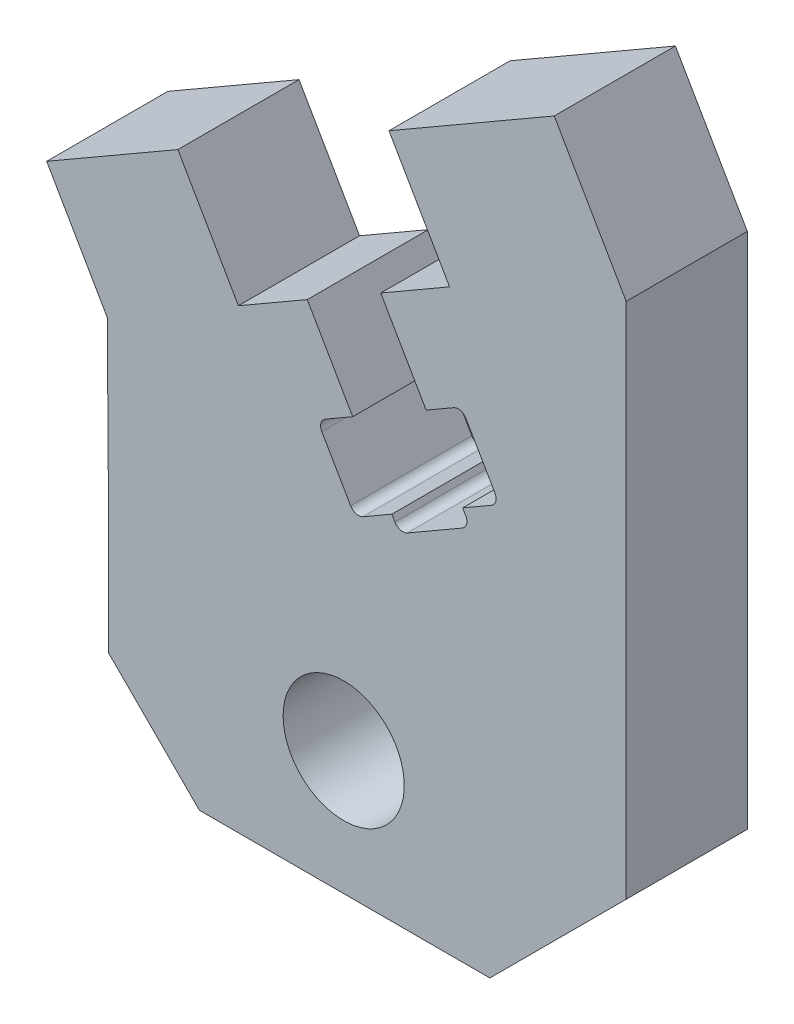
ISO-10303-21;
HEADER;
FILE_DESCRIPTION(('STEP AP214'),'2;1');
FILE_NAME('part.step','',(''),(''),'','','');
FILE_SCHEMA(('AUTOMOTIVE_DESIGN { 1 0 10303 214 1 1 1 1 }'));
ENDSEC;
DATA;
#1=APPLICATION_CONTEXT('core data for automotive mechanical design processes');
#2=APPLICATION_PROTOCOL_DEFINITION('international standard','automotive_design',2000,#1);
#3=PRODUCT_CONTEXT('',#1,'mechanical');
#4=PRODUCT('Part','Part','',(#3));
#5=PRODUCT_RELATED_PRODUCT_CATEGORY('part','',(#4));
#6=PRODUCT_DEFINITION_FORMATION('','',#4);
#7=PRODUCT_DEFINITION_CONTEXT('part definition',#1,'design');
#8=PRODUCT_DEFINITION('design','',#6,#7);
#9=PRODUCT_DEFINITION_SHAPE('','',#8);
#10=(LENGTH_UNIT() NAMED_UNIT(*) SI_UNIT(.MILLI.,.METRE.));
#11=(NAMED_UNIT(*) PLANE_ANGLE_UNIT() SI_UNIT($,.RADIAN.));
#12=(NAMED_UNIT(*) SI_UNIT($,.STERADIAN.) SOLID_ANGLE_UNIT());
#13=UNCERTAINTY_MEASURE_WITH_UNIT(LENGTH_MEASURE(1.E-05),#10,'distance_accuracy_value','');
#14=(GEOMETRIC_REPRESENTATION_CONTEXT(3) GLOBAL_UNCERTAINTY_ASSIGNED_CONTEXT((#13)) GLOBAL_UNIT_ASSIGNED_CONTEXT((#10,
#11,#12)) REPRESENTATION_CONTEXT('',''));
#15=CARTESIAN_POINT('',(0.,0.,0.));
#16=DIRECTION('',(0.,0.,1.));
#17=DIRECTION('',(1.,0.,0.));
#18=AXIS2_PLACEMENT_3D('',#15,#16,#17);
#19=CARTESIAN_POINT('',(-127.251564890503,105.942182286836,4.));
#20=DIRECTION('',(0.499999999999998,-0.86602540378444,0.));
#21=DIRECTION('',(0.86602540378444,0.499999999999998,0.));
#22=AXIS2_PLACEMENT_3D('',#19,#20,#21);
#23=PLANE('',#22);
#24=DIRECTION('',(-0.86602540378444,-0.499999999999998,0.));
#25=VECTOR('',#24,1.);
#26=CARTESIAN_POINT('',(-127.251564890503,105.942182286836,0.));
#27=LINE('',#26,#25);
#28=CARTESIAN_POINT('',(-115.950869184989,112.466641994445,0.));
#29=VERTEX_POINT('',#28);
#30=CARTESIAN_POINT('',(-118.219555533488,111.156815320432,0.));
#31=VERTEX_POINT('',#30);
#32=EDGE_CURVE('E565',#29,#31,#27,.T.);
#33=ORIENTED_EDGE('',*,*,#32,.T.);
#34=DIRECTION('',(0.,0.,1.));
#35=VECTOR('',#34,1.);
#36=CARTESIAN_POINT('',(-118.219555533488,111.156815320432,4.));
#37=LINE('',#36,#35);
#38=CARTESIAN_POINT('',(-118.219555533488,111.156815320432,4.));
#39=VERTEX_POINT('',#38);
#40=EDGE_CURVE('E11',#31,#39,#37,.T.);
#41=ORIENTED_EDGE('',*,*,#40,.T.);
#42=DIRECTION('',(-0.86602540378444,-0.499999999999998,0.));
#43=VECTOR('',#42,1.);
#44=CARTESIAN_POINT('',(-127.251564890503,105.942182286836,4.));
#45=LINE('',#44,#43);
#46=CARTESIAN_POINT('',(-115.950869184989,112.466641994445,4.));
#47=VERTEX_POINT('',#46);
#48=EDGE_CURVE('E555',#47,#39,#45,.T.);
#49=ORIENTED_EDGE('',*,*,#48,.F.);
#50=DIRECTION('',(0.,0.,1.));
#51=VECTOR('',#50,1.);
#52=CARTESIAN_POINT('',(-115.950869184989,112.466641994445,-2.26694974146776E-13));
#53=LINE('',#52,#51);
#54=EDGE_CURVE('E513',#29,#47,#53,.T.);
#55=ORIENTED_EDGE('',*,*,#54,.F.);
#56=EDGE_LOOP('',(#33,#41,#49,#55));
#57=FACE_BOUND('',#56,.T.);
#58=ADVANCED_FACE('F44',(#57),#23,.F.);
#59=CARTESIAN_POINT('',(0.,0.,4.));
#60=DIRECTION('',(0.,0.,-1.));
#61=DIRECTION('',(-1.,0.,0.));
#62=AXIS2_PLACEMENT_3D('',#59,#60,#61);
#63=PLANE('',#62);
#64=ORIENTED_EDGE('',*,*,#48,.T.);
#65=DIRECTION('',(0.491652426110984,-0.870791531825605,0.));
#66=VECTOR('',#65,1.);
#67=CARTESIAN_POINT('',(-42.0540671269402,-23.7438966447542,4.));
#68=LINE('',#67,#66);
#69=CARTESIAN_POINT('',(-117.973717962987,110.721399438748,4.));
#70=VERTEX_POINT('',#69);
#71=EDGE_CURVE('E398',#39,#70,#68,.T.);
#72=ORIENTED_EDGE('',*,*,#71,.T.);
#73=DIRECTION('',(0.499999999999994,-0.866025403784442,0.));
#74=VECTOR('',#73,1.);
#75=CARTESIAN_POINT('',(-40.5365161439809,-23.4037685077366,4.));
#76=LINE('',#75,#74);
#77=CARTESIAN_POINT('',(-116.723717962987,108.556335929287,4.));
#78=VERTEX_POINT('',#77);
#79=EDGE_CURVE('E456',#70,#78,#76,.T.);
#80=ORIENTED_EDGE('',*,*,#79,.T.);
#81=DIRECTION('',(0.866025403784442,0.499999999999994,0.));
#82=VECTOR('',#81,1.);
#83=CARTESIAN_POINT('',(-76.1872018190058,131.960104437024,4.));
#84=LINE('',#83,#82);
#85=CARTESIAN_POINT('',(-115.814391289013,109.081335929287,4.));
#86=VERTEX_POINT('',#85);
#87=EDGE_CURVE('E460',#78,#86,#84,.T.);
#88=ORIENTED_EDGE('',*,*,#87,.T.);
#89=CARTESIAN_POINT('',(-115.664391289013,108.821528308152,4.));
#90=DIRECTION('',(0.,0.,-1.));
#91=DIRECTION('',(-1.,0.,0.));
#92=AXIS2_PLACEMENT_3D('',#89,#90,#91);
#93=CIRCLE('',#92,0.300000000000005);
#94=CARTESIAN_POINT('',(-115.404583667878,108.971528308152,4.));
#95=VERTEX_POINT('',#94);
#96=EDGE_CURVE('E262',#86,#95,#93,.T.);
#97=ORIENTED_EDGE('',*,*,#96,.T.);
#98=DIRECTION('',(0.499999999999995,-0.866025403784441,0.));
#99=VECTOR('',#98,1.);
#100=CARTESIAN_POINT('',(-39.3673818488717,-22.7287685077366,4.));
#101=LINE('',#100,#99);
#102=CARTESIAN_POINT('',(-114.454583667878,107.326080040962,4.));
#103=VERTEX_POINT('',#102);
#104=EDGE_CURVE('E404',#95,#103,#101,.T.);
#105=ORIENTED_EDGE('',*,*,#104,.T.);
#106=CARTESIAN_POINT('',(-114.714391289013,107.176080040962,4.));
#107=DIRECTION('',(0.,0.,-1.));
#108=DIRECTION('',(-1.,0.,0.));
#109=AXIS2_PLACEMENT_3D('',#106,#107,#108);
#110=CIRCLE('',#109,0.299999999999996);
#111=CARTESIAN_POINT('',(-114.564391289013,106.916272419826,4.));
#112=VERTEX_POINT('',#111);
#113=EDGE_CURVE('E408',#103,#112,#110,.T.);
#114=ORIENTED_EDGE('',*,*,#113,.T.);
#115=DIRECTION('',(-0.866025403784439,-0.5,0.));
#116=VECTOR('',#115,1.);
#117=CARTESIAN_POINT('',(-74.9372018190068,129.795040927563,4.));
#118=LINE('',#117,#116);
#119=CARTESIAN_POINT('',(-115.517019233176,106.366272419826,4.));
#120=VERTEX_POINT('',#119);
#121=EDGE_CURVE('E412',#112,#120,#118,.T.);
#122=ORIENTED_EDGE('',*,*,#121,.T.);
#123=DIRECTION('',(0.500000000000073,-0.866025403784397,0.));
#124=VECTOR('',#123,1.);
#125=CARTESIAN_POINT('',(-40.5798174141562,-23.4287685077335,4.));
#126=LINE('',#125,#124);
#127=CARTESIAN_POINT('',(-115.417019233176,106.193067339069,4.));
#128=VERTEX_POINT('',#127);
#129=EDGE_CURVE('E416',#120,#128,#126,.T.);
#130=ORIENTED_EDGE('',*,*,#129,.T.);
#131=CARTESIAN_POINT('',(-115.676826854311,106.043067339069,4.));
#132=DIRECTION('',(0.,0.,-1.));
#133=DIRECTION('',(-1.,0.,0.));
#134=AXIS2_PLACEMENT_3D('',#131,#132,#133);
#135=CIRCLE('',#134,0.300000000000002);
#136=CARTESIAN_POINT('',(-115.526826854311,105.783259717934,4.));
#137=VERTEX_POINT('',#136);
#138=EDGE_CURVE('E420',#128,#137,#135,.T.);
#139=ORIENTED_EDGE('',*,*,#138,.T.);
#140=DIRECTION('',(-0.86602540378444,-0.499999999999997,0.));
#141=VECTOR('',#140,1.);
#142=CARTESIAN_POINT('',(-74.6872018190063,129.362028225671,4.));
#143=LINE('',#142,#141);
#144=CARTESIAN_POINT('',(-117.345480202259,104.733259717934,4.));
#145=VERTEX_POINT('',#144);
#146=EDGE_CURVE('E424',#137,#145,#143,.T.);
#147=ORIENTED_EDGE('',*,*,#146,.T.);
#148=CARTESIAN_POINT('',(-117.495480202259,104.993067339069,4.));
#149=DIRECTION('',(0.,0.,-1.));
#150=DIRECTION('',(-1.,0.,0.));
#151=AXIS2_PLACEMENT_3D('',#148,#149,#150);
#152=CIRCLE('',#151,0.299999999999999);
#153=CARTESIAN_POINT('',(-117.755287823394,104.843067339069,4.));
#154=VERTEX_POINT('',#153);
#155=EDGE_CURVE('E428',#145,#154,#152,.T.);
#156=ORIENTED_EDGE('',*,*,#155,.T.);
#157=DIRECTION('',(-0.499999999999939,0.866025403784474,0.));
#158=VECTOR('',#157,1.);
#159=CARTESIAN_POINT('',(-42.9180860043979,-24.7787685077386,4.));
#160=LINE('',#159,#158);
#161=CARTESIAN_POINT('',(-117.855287823394,105.016272419826,4.));
#162=VERTEX_POINT('',#161);
#163=EDGE_CURVE('E432',#154,#162,#160,.T.);
#164=ORIENTED_EDGE('',*,*,#163,.T.);
#165=DIRECTION('',(-0.866025403784436,-0.500000000000005,0.));
#166=VECTOR('',#165,1.);
#167=CARTESIAN_POINT('',(-74.9372018190078,129.795040927562,4.));
#168=LINE('',#167,#166);
#169=CARTESIAN_POINT('',(-118.807915767557,104.466272419826,4.));
#170=VERTEX_POINT('',#169);
#171=EDGE_CURVE('E436',#162,#170,#168,.T.);
#172=ORIENTED_EDGE('',*,*,#171,.T.);
#173=CARTESIAN_POINT('',(-118.957915767557,104.726080040962,4.));
#174=DIRECTION('',(0.,0.,-1.));
#175=DIRECTION('',(-1.,0.,0.));
#176=AXIS2_PLACEMENT_3D('',#173,#174,#175);
#177=CIRCLE('',#176,0.300000000000005);
#178=CARTESIAN_POINT('',(-119.217723388692,104.576080040962,4.));
#179=VERTEX_POINT('',#178);
#180=EDGE_CURVE('E440',#170,#179,#177,.T.);
#181=ORIENTED_EDGE('',*,*,#180,.T.);
#182=DIRECTION('',(-0.499999999999975,0.866025403784453,0.));
#183=VECTOR('',#182,1.);
#184=CARTESIAN_POINT('',(-44.1305215696898,-25.4787685077373,4.));
#185=LINE('',#184,#183);
#186=CARTESIAN_POINT('',(-120.167723388692,106.221528308152,4.));
#187=VERTEX_POINT('',#186);
#188=EDGE_CURVE('E444',#179,#187,#185,.T.);
#189=ORIENTED_EDGE('',*,*,#188,.T.);
#190=CARTESIAN_POINT('',(-119.907915767557,106.371528308152,4.));
#191=DIRECTION('',(0.,0.,-1.));
#192=DIRECTION('',(-1.,0.,0.));
#193=AXIS2_PLACEMENT_3D('',#190,#191,#192);
#194=CIRCLE('',#193,0.300000000000027);
#195=CARTESIAN_POINT('',(-120.057915767557,106.631335929287,4.));
#196=VERTEX_POINT('',#195);
#197=EDGE_CURVE('E448',#187,#196,#194,.T.);
#198=ORIENTED_EDGE('',*,*,#197,.T.);
#199=DIRECTION('',(0.866025403784439,0.499999999999999,0.));
#200=VECTOR('',#199,1.);
#201=CARTESIAN_POINT('',(-76.1872018190066,131.960104437024,4.));
#202=LINE('',#201,#200);
#203=CARTESIAN_POINT('',(-119.148589093583,107.156335929287,4.));
#204=VERTEX_POINT('',#203);
#205=EDGE_CURVE('E452',#196,#204,#202,.T.);
#206=ORIENTED_EDGE('',*,*,#205,.T.);
#207=DIRECTION('',(-0.499999999999999,0.866025403784439,0.));
#208=VECTOR('',#207,1.);
#209=CARTESIAN_POINT('',(-42.9613872745764,-24.8037685077364,4.));
#210=LINE('',#209,#208);
#211=CARTESIAN_POINT('',(-120.648589093583,109.754412140641,4.));
#212=VERTEX_POINT('',#211);
#213=EDGE_CURVE('E350',#204,#212,#210,.T.);
#214=ORIENTED_EDGE('',*,*,#213,.T.);
#215=CARTESIAN_POINT('',(-122.921437871581,108.442182286836,4.));
#216=VERTEX_POINT('',#215);
#217=EDGE_CURVE('E560',#212,#216,#45,.T.);
#218=ORIENTED_EDGE('',*,*,#217,.T.);
#219=DIRECTION('',(0.499999999999998,-0.86602540378444,0.));
#220=VECTOR('',#219,1.);
#221=CARTESIAN_POINT('',(-125.421437871581,112.772309305759,4.));
#222=LINE('',#221,#220);
#223=CARTESIAN_POINT('',(-124.921437871581,111.906283901974,4.));
#224=VERTEX_POINT('',#223);
#225=EDGE_CURVE('E537',#224,#216,#222,.T.);
#226=ORIENTED_EDGE('',*,*,#225,.F.);
#227=DIRECTION('',(0.866025403784441,0.499999999999996,0.));
#228=VECTOR('',#227,1.);
#229=CARTESIAN_POINT('',(-129.251564890503,109.406283901974,4.));
#230=LINE('',#229,#228);
#231=CARTESIAN_POINT('',(-129.251564890503,109.406283901974,4.));
#232=VERTEX_POINT('',#231);
#233=EDGE_CURVE('E467',#232,#224,#230,.T.);
#234=ORIENTED_EDGE('',*,*,#233,.F.);
#235=DIRECTION('',(0.499999999999998,-0.86602540378444,0.));
#236=VECTOR('',#235,1.);
#237=CARTESIAN_POINT('',(-129.751564890503,110.272309305759,4.));
#238=LINE('',#237,#236);
#239=CARTESIAN_POINT('',(-127.251564890503,105.942182286836,4.));
#240=VERTEX_POINT('',#239);
#241=EDGE_CURVE('E527',#232,#240,#238,.T.);
#242=ORIENTED_EDGE('',*,*,#241,.T.);
#243=DIRECTION('',(0.00760615536184808,-0.999971072781914,0.));
#244=VECTOR('',#243,1.);
#245=CARTESIAN_POINT('',(-127.209199434183,100.372452404922,4.));
#246=LINE('',#245,#244);
#247=CARTESIAN_POINT('',(-127.209199434183,100.372452404922,4.));
#248=VERTEX_POINT('',#247);
#249=EDGE_CURVE('E559',#240,#248,#246,.T.);
#250=ORIENTED_EDGE('',*,*,#249,.T.);
#251=DIRECTION('',(0.,1.,0.));
#252=VECTOR('',#251,1.);
#253=CARTESIAN_POINT('',(-127.209199434183,98.3724524049218,4.));
#254=LINE('',#253,#252);
#255=CARTESIAN_POINT('',(-127.209199434183,96.3724524049218,4.));
#256=VERTEX_POINT('',#255);
#257=EDGE_CURVE('E549',#256,#248,#254,.T.);
#258=ORIENTED_EDGE('',*,*,#257,.F.);
#259=DIRECTION('',(0.707106781186548,-0.707106781186548,0.));
#260=VECTOR('',#259,1.);
#261=CARTESIAN_POINT('',(-124.209199434183,93.3724524049218,4.));
#262=LINE('',#261,#260);
#263=CARTESIAN_POINT('',(-124.209199434183,93.3724524049218,4.));
#264=VERTEX_POINT('',#263);
#265=EDGE_CURVE('E590',#256,#264,#262,.T.);
#266=ORIENTED_EDGE('',*,*,#265,.T.);
#267=DIRECTION('',(-1.,0.,0.));
#268=VECTOR('',#267,1.);
#269=CARTESIAN_POINT('',(-111.620742166067,93.3724524049218,4.));
#270=LINE('',#269,#268);
#271=CARTESIAN_POINT('',(-114.620742166067,93.3724524049218,4.));
#272=VERTEX_POINT('',#271);
#273=EDGE_CURVE('E541',#272,#264,#270,.T.);
#274=ORIENTED_EDGE('',*,*,#273,.F.);
#275=DIRECTION('',(0.707106781186544,0.707106781186551,0.));
#276=VECTOR('',#275,1.);
#277=CARTESIAN_POINT('',(-114.620742166067,93.3724524049218,4.));
#278=LINE('',#277,#276);
#279=CARTESIAN_POINT('',(-110.120742166067,97.8724524049218,4.));
#280=VERTEX_POINT('',#279);
#281=EDGE_CURVE('E593',#272,#280,#278,.T.);
#282=ORIENTED_EDGE('',*,*,#281,.T.);
#283=DIRECTION('',(0.,1.,0.));
#284=VECTOR('',#283,1.);
#285=CARTESIAN_POINT('',(-110.120742166067,114.966641994445,4.));
#286=LINE('',#285,#284);
#287=CARTESIAN_POINT('',(-110.120742166067,114.966641994445,4.));
#288=VERTEX_POINT('',#287);
#289=EDGE_CURVE('E491',#280,#288,#286,.T.);
#290=ORIENTED_EDGE('',*,*,#289,.T.);
#291=DIRECTION('',(-0.499999999999993,0.866025403784443,0.));
#292=VECTOR('',#291,1.);
#293=CARTESIAN_POINT('',(-110.120742166067,114.966641994445,4.));
#294=LINE('',#293,#292);
#295=CARTESIAN_POINT('',(-112.495742166067,119.080262662421,4.));
#296=VERTEX_POINT('',#295);
#297=EDGE_CURVE('E487',#288,#296,#294,.T.);
#298=ORIENTED_EDGE('',*,*,#297,.T.);
#299=DIRECTION('',(0.866025403784439,0.5,0.));
#300=VECTOR('',#299,1.);
#301=CARTESIAN_POINT('',(-117.950869184989,115.930743609583,4.));
#302=LINE('',#301,#300);
#303=CARTESIAN_POINT('',(-117.950869184989,115.930743609583,4.));
#304=VERTEX_POINT('',#303);
#305=EDGE_CURVE('E468',#304,#296,#302,.T.);
#306=ORIENTED_EDGE('',*,*,#305,.F.);
#307=DIRECTION('',(0.499999999999998,-0.86602540378444,0.));
#308=VECTOR('',#307,1.);
#309=CARTESIAN_POINT('',(-118.450869184989,116.796769013367,4.));
#310=LINE('',#309,#308);
#311=EDGE_CURVE('E517',#304,#47,#310,.T.);
#312=ORIENTED_EDGE('',*,*,#311,.T.);
#313=EDGE_LOOP('',(#64,#72,#80,#88,#97,#105,#114,#122,#130,#139,#147,#156,#164,#172,#181,#189,
#198,#206,#214,#218,#226,#234,#242,#250,#258,#266,#274,#282,#290,#298,#306,#312));
#314=FACE_BOUND('',#313,.T.);
#315=CARTESIAN_POINT('',(-119.446049425251,97.4583176850972,4.));
#316=DIRECTION('',(0.,0.,-1.));
#317=DIRECTION('',(-1.,0.,0.));
#318=AXIS2_PLACEMENT_3D('',#315,#316,#317);
#319=CIRCLE('',#318,1.99999999999999);
#320=CARTESIAN_POINT('',(-121.446049425251,97.4583176850972,4.));
#321=VERTEX_POINT('',#320);
#322=EDGE_CURVE('E509',#321,#321,#319,.T.);
#323=ORIENTED_EDGE('',*,*,#322,.T.);
#324=EDGE_LOOP('',(#323));
#325=FACE_BOUND('',#324,.T.);
#326=ADVANCED_FACE('F616',(#314,#325),#63,.F.);
#327=CARTESIAN_POINT('',(0.,0.,0.));
#328=DIRECTION('',(0.,0.,-1.));
#329=DIRECTION('',(-1.,0.,0.));
#330=AXIS2_PLACEMENT_3D('',#327,#328,#329);
#331=PLANE('',#330);
#332=DIRECTION('',(0.491652426110985,-0.870791531825605,0.));
#333=VECTOR('',#332,1.);
#334=CARTESIAN_POINT('',(-117.973717962987,110.721399438748,0.));
#335=LINE('',#334,#333);
#336=CARTESIAN_POINT('',(-117.973717962987,110.721399438748,0.));
#337=VERTEX_POINT('',#336);
#338=EDGE_CURVE('E342',#31,#337,#335,.T.);
#339=ORIENTED_EDGE('',*,*,#338,.F.);
#340=ORIENTED_EDGE('',*,*,#32,.F.);
#341=DIRECTION('',(0.499999999999998,-0.86602540378444,0.));
#342=VECTOR('',#341,1.);
#343=CARTESIAN_POINT('',(-118.450869184989,116.796769013367,0.));
#344=LINE('',#343,#342);
#345=CARTESIAN_POINT('',(-117.950869184989,115.930743609583,0.));
#346=VERTEX_POINT('',#345);
#347=EDGE_CURVE('E520',#346,#29,#344,.T.);
#348=ORIENTED_EDGE('',*,*,#347,.F.);
#349=DIRECTION('',(-0.866025403784439,-0.499999999999999,0.));
#350=VECTOR('',#349,1.);
#351=CARTESIAN_POINT('',(-112.495742166067,119.080262662421,0.));
#352=LINE('',#351,#350);
#353=CARTESIAN_POINT('',(-112.495742166067,119.080262662421,0.));
#354=VERTEX_POINT('',#353);
#355=EDGE_CURVE('E479',#354,#346,#352,.T.);
#356=ORIENTED_EDGE('',*,*,#355,.F.);
#357=DIRECTION('',(0.499999999999993,-0.866025403784443,0.));
#358=VECTOR('',#357,1.);
#359=CARTESIAN_POINT('',(-110.120742166067,114.966641994445,0.));
#360=LINE('',#359,#358);
#361=CARTESIAN_POINT('',(-110.120742166067,114.966641994445,0.));
#362=VERTEX_POINT('',#361);
#363=EDGE_CURVE('E476',#354,#362,#360,.T.);
#364=ORIENTED_EDGE('',*,*,#363,.T.);
#365=DIRECTION('',(0.,-1.,0.));
#366=VECTOR('',#365,1.);
#367=CARTESIAN_POINT('',(-110.120742166067,114.966641994445,0.));
#368=LINE('',#367,#366);
#369=CARTESIAN_POINT('',(-110.120742166067,97.8724524049218,0.));
#370=VERTEX_POINT('',#369);
#371=EDGE_CURVE('E498',#362,#370,#368,.T.);
#372=ORIENTED_EDGE('',*,*,#371,.T.);
#373=DIRECTION('',(-0.707106781186544,-0.707106781186551,0.));
#374=VECTOR('',#373,1.);
#375=CARTESIAN_POINT('',(-103.996597285495,103.996597285494,0.));
#376=LINE('',#375,#374);
#377=CARTESIAN_POINT('',(-114.620742166067,93.3724524049218,0.));
#378=VERTEX_POINT('',#377);
#379=EDGE_CURVE('E599',#370,#378,#376,.T.);
#380=ORIENTED_EDGE('',*,*,#379,.T.);
#381=DIRECTION('',(1.,0.,0.));
#382=VECTOR('',#381,1.);
#383=CARTESIAN_POINT('',(-127.209199434183,93.3724524049218,0.));
#384=LINE('',#383,#382);
#385=CARTESIAN_POINT('',(-124.209199434183,93.3724524049218,0.));
#386=VERTEX_POINT('',#385);
#387=EDGE_CURVE('E545',#386,#378,#384,.T.);
#388=ORIENTED_EDGE('',*,*,#387,.F.);
#389=DIRECTION('',(-0.707106781186548,0.707106781186548,0.));
#390=VECTOR('',#389,1.);
#391=CARTESIAN_POINT('',(-15.4183735146305,-15.4183735146305,0.));
#392=LINE('',#391,#390);
#393=CARTESIAN_POINT('',(-127.209199434183,96.3724524049218,0.));
#394=VERTEX_POINT('',#393);
#395=EDGE_CURVE('E596',#386,#394,#392,.T.);
#396=ORIENTED_EDGE('',*,*,#395,.T.);
#397=DIRECTION('',(0.,1.,0.));
#398=VECTOR('',#397,1.);
#399=CARTESIAN_POINT('',(-127.209199434183,98.3724524049218,0.));
#400=LINE('',#399,#398);
#401=CARTESIAN_POINT('',(-127.209199434183,100.372452404922,0.));
#402=VERTEX_POINT('',#401);
#403=EDGE_CURVE('E552',#394,#402,#400,.T.);
#404=ORIENTED_EDGE('',*,*,#403,.T.);
#405=DIRECTION('',(0.00760615536184808,-0.999971072781914,0.));
#406=VECTOR('',#405,1.);
#407=CARTESIAN_POINT('',(-127.209199434183,100.372452404922,0.));
#408=LINE('',#407,#406);
#409=CARTESIAN_POINT('',(-127.251564890503,105.942182286836,0.));
#410=VERTEX_POINT('',#409);
#411=EDGE_CURVE('E569',#410,#402,#408,.T.);
#412=ORIENTED_EDGE('',*,*,#411,.F.);
#413=DIRECTION('',(0.499999999999998,-0.86602540378444,0.));
#414=VECTOR('',#413,1.);
#415=CARTESIAN_POINT('',(-129.751564890503,110.272309305759,0.));
#416=LINE('',#415,#414);
#417=CARTESIAN_POINT('',(-129.251564890503,109.406283901974,0.));
#418=VERTEX_POINT('',#417);
#419=EDGE_CURVE('E530',#418,#410,#416,.T.);
#420=ORIENTED_EDGE('',*,*,#419,.F.);
#421=DIRECTION('',(-0.86602540378444,-0.499999999999997,0.));
#422=VECTOR('',#421,1.);
#423=CARTESIAN_POINT('',(-124.921437871581,111.906283901974,0.));
#424=LINE('',#423,#422);
#425=CARTESIAN_POINT('',(-124.921437871581,111.906283901974,0.));
#426=VERTEX_POINT('',#425);
#427=EDGE_CURVE('E68',#426,#418,#424,.T.);
#428=ORIENTED_EDGE('',*,*,#427,.F.);
#429=DIRECTION('',(0.499999999999998,-0.86602540378444,0.));
#430=VECTOR('',#429,1.);
#431=CARTESIAN_POINT('',(-125.421437871581,112.772309305759,0.));
#432=LINE('',#431,#430);
#433=CARTESIAN_POINT('',(-122.921437871581,108.442182286836,0.));
#434=VERTEX_POINT('',#433);
#435=EDGE_CURVE('E533',#426,#434,#432,.T.);
#436=ORIENTED_EDGE('',*,*,#435,.T.);
#437=CARTESIAN_POINT('',(-120.648589093583,109.754412140641,0.));
#438=VERTEX_POINT('',#437);
#439=EDGE_CURVE('E554',#438,#434,#27,.T.);
#440=ORIENTED_EDGE('',*,*,#439,.F.);
#441=DIRECTION('',(-0.499999999999999,0.866025403784439,0.));
#442=VECTOR('',#441,1.);
#443=CARTESIAN_POINT('',(-121.412093101533,111.076839874193,0.));
#444=LINE('',#443,#442);
#445=CARTESIAN_POINT('',(-119.148589093583,107.156335929287,0.));
#446=VERTEX_POINT('',#445);
#447=EDGE_CURVE('E60',#446,#438,#444,.T.);
#448=ORIENTED_EDGE('',*,*,#447,.F.);
#449=DIRECTION('',(0.866025403784439,0.499999999999999,0.));
#450=VECTOR('',#449,1.);
#451=CARTESIAN_POINT('',(-119.148589093583,107.156335929287,0.));
#452=LINE('',#451,#450);
#453=CARTESIAN_POINT('',(-120.057915767557,106.631335929287,0.));
#454=VERTEX_POINT('',#453);
#455=EDGE_CURVE('E336',#454,#446,#452,.T.);
#456=ORIENTED_EDGE('',*,*,#455,.F.);
#457=CARTESIAN_POINT('',(-119.907915767557,106.371528308152,0.));
#458=DIRECTION('',(0.,0.,-1.));
#459=DIRECTION('',(-1.,0.,0.));
#460=AXIS2_PLACEMENT_3D('',#457,#458,#459);
#461=CIRCLE('',#460,0.300000000000027);
#462=CARTESIAN_POINT('',(-120.167723388692,106.221528308152,0.));
#463=VERTEX_POINT('',#462);
#464=EDGE_CURVE('E332',#463,#454,#461,.T.);
#465=ORIENTED_EDGE('',*,*,#464,.F.);
#466=DIRECTION('',(-0.499999999999975,0.866025403784453,0.));
#467=VECTOR('',#466,1.);
#468=CARTESIAN_POINT('',(-120.167723388692,106.221528308152,0.));
#469=LINE('',#468,#467);
#470=CARTESIAN_POINT('',(-119.217723388692,104.576080040962,0.));
#471=VERTEX_POINT('',#470);
#472=EDGE_CURVE('E328',#471,#463,#469,.T.);
#473=ORIENTED_EDGE('',*,*,#472,.F.);
#474=CARTESIAN_POINT('',(-118.957915767557,104.726080040962,0.));
#475=DIRECTION('',(0.,0.,-1.));
#476=DIRECTION('',(-1.,0.,0.));
#477=AXIS2_PLACEMENT_3D('',#474,#475,#476);
#478=CIRCLE('',#477,0.300000000000005);
#479=CARTESIAN_POINT('',(-118.807915767557,104.466272419826,0.));
#480=VERTEX_POINT('',#479);
#481=EDGE_CURVE('E324',#480,#471,#478,.T.);
#482=ORIENTED_EDGE('',*,*,#481,.F.);
#483=DIRECTION('',(-0.866025403784436,-0.500000000000005,0.));
#484=VECTOR('',#483,1.);
#485=CARTESIAN_POINT('',(-118.807915767557,104.466272419826,0.));
#486=LINE('',#485,#484);
#487=CARTESIAN_POINT('',(-117.855287823394,105.016272419826,0.));
#488=VERTEX_POINT('',#487);
#489=EDGE_CURVE('E320',#488,#480,#486,.T.);
#490=ORIENTED_EDGE('',*,*,#489,.F.);
#491=DIRECTION('',(-0.499999999999939,0.866025403784474,0.));
#492=VECTOR('',#491,1.);
#493=CARTESIAN_POINT('',(-117.855287823394,105.016272419826,0.));
#494=LINE('',#493,#492);
#495=CARTESIAN_POINT('',(-117.755287823394,104.843067339069,0.));
#496=VERTEX_POINT('',#495);
#497=EDGE_CURVE('E316',#496,#488,#494,.T.);
#498=ORIENTED_EDGE('',*,*,#497,.F.);
#499=CARTESIAN_POINT('',(-117.495480202259,104.993067339069,0.));
#500=DIRECTION('',(0.,0.,-1.));
#501=DIRECTION('',(-1.,0.,0.));
#502=AXIS2_PLACEMENT_3D('',#499,#500,#501);
#503=CIRCLE('',#502,0.299999999999999);
#504=CARTESIAN_POINT('',(-117.345480202259,104.733259717934,0.));
#505=VERTEX_POINT('',#504);
#506=EDGE_CURVE('E312',#505,#496,#503,.T.);
#507=ORIENTED_EDGE('',*,*,#506,.F.);
#508=DIRECTION('',(-0.86602540378444,-0.499999999999997,0.));
#509=VECTOR('',#508,1.);
#510=CARTESIAN_POINT('',(-117.345480202259,104.733259717934,0.));
#511=LINE('',#510,#509);
#512=CARTESIAN_POINT('',(-115.526826854311,105.783259717934,0.));
#513=VERTEX_POINT('',#512);
#514=EDGE_CURVE('E308',#513,#505,#511,.T.);
#515=ORIENTED_EDGE('',*,*,#514,.F.);
#516=CARTESIAN_POINT('',(-115.676826854311,106.043067339069,0.));
#517=DIRECTION('',(0.,0.,-1.));
#518=DIRECTION('',(-1.,0.,0.));
#519=AXIS2_PLACEMENT_3D('',#516,#517,#518);
#520=CIRCLE('',#519,0.300000000000002);
#521=CARTESIAN_POINT('',(-115.417019233176,106.193067339069,0.));
#522=VERTEX_POINT('',#521);
#523=EDGE_CURVE('E304',#522,#513,#520,.T.);
#524=ORIENTED_EDGE('',*,*,#523,.F.);
#525=DIRECTION('',(0.500000000000073,-0.866025403784397,0.));
#526=VECTOR('',#525,1.);
#527=CARTESIAN_POINT('',(-115.417019233176,106.193067339069,0.));
#528=LINE('',#527,#526);
#529=CARTESIAN_POINT('',(-115.517019233176,106.366272419826,0.));
#530=VERTEX_POINT('',#529);
#531=EDGE_CURVE('E300',#530,#522,#528,.T.);
#532=ORIENTED_EDGE('',*,*,#531,.F.);
#533=DIRECTION('',(-0.866025403784439,-0.5,0.));
#534=VECTOR('',#533,1.);
#535=CARTESIAN_POINT('',(-115.517019233176,106.366272419826,0.));
#536=LINE('',#535,#534);
#537=CARTESIAN_POINT('',(-114.564391289013,106.916272419826,0.));
#538=VERTEX_POINT('',#537);
#539=EDGE_CURVE('E296',#538,#530,#536,.T.);
#540=ORIENTED_EDGE('',*,*,#539,.F.);
#541=CARTESIAN_POINT('',(-114.714391289013,107.176080040962,0.));
#542=DIRECTION('',(0.,0.,-1.));
#543=DIRECTION('',(-1.,0.,0.));
#544=AXIS2_PLACEMENT_3D('',#541,#542,#543);
#545=CIRCLE('',#544,0.299999999999996);
#546=CARTESIAN_POINT('',(-114.454583667878,107.326080040962,0.));
#547=VERTEX_POINT('',#546);
#548=EDGE_CURVE('E290',#547,#538,#545,.T.);
#549=ORIENTED_EDGE('',*,*,#548,.F.);
#550=DIRECTION('',(0.499999999999995,-0.866025403784441,0.));
#551=VECTOR('',#550,1.);
#552=CARTESIAN_POINT('',(-114.454583667878,107.326080040962,0.));
#553=LINE('',#552,#551);
#554=CARTESIAN_POINT('',(-115.404583667878,108.971528308152,0.));
#555=VERTEX_POINT('',#554);
#556=EDGE_CURVE('E284',#555,#547,#553,.T.);
#557=ORIENTED_EDGE('',*,*,#556,.F.);
#558=CARTESIAN_POINT('',(-115.664391289013,108.821528308152,0.));
#559=DIRECTION('',(0.,0.,-1.));
#560=DIRECTION('',(-1.,0.,0.));
#561=AXIS2_PLACEMENT_3D('',#558,#559,#560);
#562=CIRCLE('',#561,0.300000000000005);
#563=CARTESIAN_POINT('',(-115.814391289013,109.081335929287,0.));
#564=VERTEX_POINT('',#563);
#565=EDGE_CURVE('E259',#564,#555,#562,.T.);
#566=ORIENTED_EDGE('',*,*,#565,.F.);
#567=DIRECTION('',(0.866025403784442,0.499999999999994,0.));
#568=VECTOR('',#567,1.);
#569=CARTESIAN_POINT('',(-115.814391289013,109.081335929287,0.));
#570=LINE('',#569,#568);
#571=CARTESIAN_POINT('',(-116.723717962987,108.556335929287,0.));
#572=VERTEX_POINT('',#571);
#573=EDGE_CURVE('E270',#572,#564,#570,.T.);
#574=ORIENTED_EDGE('',*,*,#573,.F.);
#575=DIRECTION('',(0.499999999999994,-0.866025403784442,0.));
#576=VECTOR('',#575,1.);
#577=CARTESIAN_POINT('',(-116.723717962987,108.556335929287,0.));
#578=LINE('',#577,#576);
#579=EDGE_CURVE('E267',#337,#572,#578,.T.);
#580=ORIENTED_EDGE('',*,*,#579,.F.);
#581=EDGE_LOOP('',(#339,#340,#348,#356,#364,#372,#380,#388,#396,#404,#412,#420,#428,#436,#440,
#448,#456,#465,#473,#482,#490,#498,#507,#515,#524,#532,#540,#549,#557,#566,#574,#580));
#582=FACE_BOUND('',#581,.T.);
#583=CARTESIAN_POINT('',(-119.446049425251,97.4583176850972,0.));
#584=DIRECTION('',(0.,0.,-1.));
#585=DIRECTION('',(-1.,0.,0.));
#586=AXIS2_PLACEMENT_3D('',#583,#584,#585);
#587=CIRCLE('',#586,1.99999999999999);
#588=CARTESIAN_POINT('',(-121.446049425251,97.4583176850972,0.));
#589=VERTEX_POINT('',#588);
#590=EDGE_CURVE('E495',#589,#589,#587,.T.);
#591=ORIENTED_EDGE('',*,*,#590,.F.);
#592=EDGE_LOOP('',(#591));
#593=FACE_BOUND('',#592,.T.);
#594=ADVANCED_FACE('F280',(#582,#593),#331,.T.);
#595=CARTESIAN_POINT('',(-125.421437871581,112.772309305759,0.));
#596=DIRECTION('',(-0.86602540378444,-0.499999999999998,0.));
#597=DIRECTION('',(0.499999999999998,-0.86602540378444,0.));
#598=AXIS2_PLACEMENT_3D('',#595,#596,#597);
#599=PLANE('',#598);
#600=DIRECTION('',(0.,0.,-1.));
#601=VECTOR('',#600,1.);
#602=CARTESIAN_POINT('',(-124.921437871581,111.906283901974,4.));
#603=LINE('',#602,#601);
#604=EDGE_CURVE('E471',#224,#426,#603,.T.);
#605=ORIENTED_EDGE('',*,*,#604,.F.);
#606=ORIENTED_EDGE('',*,*,#225,.T.);
#607=DIRECTION('',(0.,0.,-1.));
#608=VECTOR('',#607,1.);
#609=CARTESIAN_POINT('',(-122.921437871581,108.442182286836,0.));
#610=LINE('',#609,#608);
#611=EDGE_CURVE('E523',#216,#434,#610,.T.);
#612=ORIENTED_EDGE('',*,*,#611,.T.);
#613=ORIENTED_EDGE('',*,*,#435,.F.);
#614=EDGE_LOOP('',(#605,#606,#612,#613));
#615=FACE_BOUND('',#614,.T.);
#616=ADVANCED_FACE('F621',(#615),#599,.F.);
#617=CARTESIAN_POINT('',(-129.751564890503,110.272309305759,0.));
#618=DIRECTION('',(0.86602540378444,0.499999999999998,0.));
#619=DIRECTION('',(-0.499999999999998,0.86602540378444,0.));
#620=AXIS2_PLACEMENT_3D('',#617,#618,#619);
#621=PLANE('',#620);
#622=DIRECTION('',(0.,0.,1.));
#623=VECTOR('',#622,1.);
#624=CARTESIAN_POINT('',(-129.251564890503,109.406283901974,0.));
#625=LINE('',#624,#623);
#626=EDGE_CURVE('E464',#418,#232,#625,.T.);
#627=ORIENTED_EDGE('',*,*,#626,.F.);
#628=ORIENTED_EDGE('',*,*,#419,.T.);
#629=DIRECTION('',(0.,0.,-1.));
#630=VECTOR('',#629,1.);
#631=CARTESIAN_POINT('',(-127.251564890503,105.942182286836,4.));
#632=LINE('',#631,#630);
#633=EDGE_CURVE('E576',#240,#410,#632,.T.);
#634=ORIENTED_EDGE('',*,*,#633,.F.);
#635=ORIENTED_EDGE('',*,*,#241,.F.);
#636=EDGE_LOOP('',(#627,#628,#634,#635));
#637=FACE_BOUND('',#636,.T.);
#638=ADVANCED_FACE('F627',(#637),#621,.F.);
#639=CARTESIAN_POINT('',(-118.450869184989,116.796769013367,-2.26694974146776E-13));
#640=DIRECTION('',(0.86602540378444,0.499999999999998,0.));
#641=DIRECTION('',(-0.499999999999998,0.86602540378444,0.));
#642=AXIS2_PLACEMENT_3D('',#639,#640,#641);
#643=PLANE('',#642);
#644=DIRECTION('',(0.,0.,1.));
#645=VECTOR('',#644,1.);
#646=CARTESIAN_POINT('',(-117.950869184989,115.930743609583,0.));
#647=LINE('',#646,#645);
#648=EDGE_CURVE('E482',#346,#304,#647,.T.);
#649=ORIENTED_EDGE('',*,*,#648,.F.);
#650=ORIENTED_EDGE('',*,*,#347,.T.);
#651=ORIENTED_EDGE('',*,*,#54,.T.);
#652=ORIENTED_EDGE('',*,*,#311,.F.);
#653=EDGE_LOOP('',(#649,#650,#651,#652));
#654=FACE_BOUND('',#653,.T.);
#655=ADVANCED_FACE('F667',(#654),#643,.F.);
#656=CARTESIAN_POINT('',(-110.120742166067,114.966641994445,27.9107868499808));
#657=DIRECTION('',(0.866025403784443,0.499999999999993,0.));
#658=DIRECTION('',(-0.499999999999993,0.866025403784443,0.));
#659=AXIS2_PLACEMENT_3D('',#656,#657,#658);
#660=PLANE('',#659);
#661=ORIENTED_EDGE('',*,*,#363,.F.);
#662=DIRECTION('',(0.,0.,-1.));
#663=VECTOR('',#662,1.);
#664=CARTESIAN_POINT('',(-112.495742166067,119.080262662421,4.));
#665=LINE('',#664,#663);
#666=EDGE_CURVE('E463',#296,#354,#665,.T.);
#667=ORIENTED_EDGE('',*,*,#666,.F.);
#668=ORIENTED_EDGE('',*,*,#297,.F.);
#669=DIRECTION('',(0.,0.,-1.));
#670=VECTOR('',#669,1.);
#671=CARTESIAN_POINT('',(-110.120742166067,114.966641994445,27.9107868499808));
#672=LINE('',#671,#670);
#673=EDGE_CURVE('E502',#288,#362,#672,.T.);
#674=ORIENTED_EDGE('',*,*,#673,.T.);
#675=EDGE_LOOP('',(#661,#667,#668,#674));
#676=FACE_BOUND('',#675,.T.);
#677=ADVANCED_FACE('F658',(#676),#660,.T.);
#678=ORIENTED_EDGE('',*,*,#217,.F.);
#679=DIRECTION('',(0.,0.,-1.));
#680=VECTOR('',#679,1.);
#681=CARTESIAN_POINT('',(-120.648589093583,109.754412140641,4.));
#682=LINE('',#681,#680);
#683=EDGE_CURVE('E53',#212,#438,#682,.T.);
#684=ORIENTED_EDGE('',*,*,#683,.T.);
#685=ORIENTED_EDGE('',*,*,#439,.T.);
#686=ORIENTED_EDGE('',*,*,#611,.F.);
#687=EDGE_LOOP('',(#678,#684,#685,#686));
#688=FACE_BOUND('',#687,.T.);
#689=ADVANCED_FACE('F608',(#688),#23,.F.);
#690=CARTESIAN_POINT('',(-127.209199434183,100.372452404922,4.));
#691=DIRECTION('',(0.999971072781914,0.00760615536184808,0.));
#692=DIRECTION('',(-0.00760615536184808,0.999971072781914,0.));
#693=AXIS2_PLACEMENT_3D('',#690,#691,#692);
#694=PLANE('',#693);
#695=ORIENTED_EDGE('',*,*,#411,.T.);
#696=DIRECTION('',(0.,0.,-1.));
#697=VECTOR('',#696,1.);
#698=CARTESIAN_POINT('',(-127.209199434183,100.372452404922,4.));
#699=LINE('',#698,#697);
#700=EDGE_CURVE('E564',#248,#402,#699,.T.);
#701=ORIENTED_EDGE('',*,*,#700,.F.);
#702=ORIENTED_EDGE('',*,*,#249,.F.);
#703=ORIENTED_EDGE('',*,*,#633,.T.);
#704=EDGE_LOOP('',(#695,#701,#702,#703));
#705=FACE_BOUND('',#704,.T.);
#706=ADVANCED_FACE('F631',(#705),#694,.F.);
#707=CARTESIAN_POINT('',(-127.209199434183,98.3724524049218,4.));
#708=DIRECTION('',(1.,0.,0.));
#709=DIRECTION('',(0.,0.,-1.));
#710=AXIS2_PLACEMENT_3D('',#707,#708,#709);
#711=PLANE('',#710);
#712=ORIENTED_EDGE('',*,*,#403,.F.);
#713=DIRECTION('',(0.,0.,1.));
#714=VECTOR('',#713,1.);
#715=CARTESIAN_POINT('',(-127.209199434183,96.3724524049218,4.));
#716=LINE('',#715,#714);
#717=EDGE_CURVE('E602',#394,#256,#716,.T.);
#718=ORIENTED_EDGE('',*,*,#717,.T.);
#719=ORIENTED_EDGE('',*,*,#257,.T.);
#720=ORIENTED_EDGE('',*,*,#700,.T.);
#721=EDGE_LOOP('',(#712,#718,#719,#720));
#722=FACE_BOUND('',#721,.T.);
#723=ADVANCED_FACE('F745',(#722),#711,.F.);
#724=CARTESIAN_POINT('',(0.,93.3724524049218,0.));
#725=DIRECTION('',(0.,-1.,0.));
#726=DIRECTION('',(0.,0.,-1.));
#727=AXIS2_PLACEMENT_3D('',#724,#725,#726);
#728=PLANE('',#727);
#729=ORIENTED_EDGE('',*,*,#387,.T.);
#730=DIRECTION('',(0.,0.,1.));
#731=VECTOR('',#730,1.);
#732=CARTESIAN_POINT('',(-114.620742166067,93.3724524049218,4.));
#733=LINE('',#732,#731);
#734=EDGE_CURVE('E586',#378,#272,#733,.T.);
#735=ORIENTED_EDGE('',*,*,#734,.T.);
#736=ORIENTED_EDGE('',*,*,#273,.T.);
#737=DIRECTION('',(0.,0.,-1.));
#738=VECTOR('',#737,1.);
#739=CARTESIAN_POINT('',(-124.209199434183,93.3724524049218,0.));
#740=LINE('',#739,#738);
#741=EDGE_CURVE('E580',#264,#386,#740,.T.);
#742=ORIENTED_EDGE('',*,*,#741,.T.);
#743=EDGE_LOOP('',(#729,#735,#736,#742));
#744=FACE_BOUND('',#743,.T.);
#745=ADVANCED_FACE('F642',(#744),#728,.T.);
#746=CARTESIAN_POINT('',(-119.446049425251,97.4583176850972,-145.));
#747=DIRECTION('',(0.,0.,1.));
#748=DIRECTION('',(1.,0.,0.));
#749=AXIS2_PLACEMENT_3D('',#746,#747,#748);
#750=CYLINDRICAL_SURFACE('',#749,1.99999999999999);
#751=ORIENTED_EDGE('',*,*,#590,.T.);
#752=EDGE_LOOP('',(#751));
#753=FACE_BOUND('',#752,.T.);
#754=ORIENTED_EDGE('',*,*,#322,.F.);
#755=EDGE_LOOP('',(#754));
#756=FACE_BOUND('',#755,.T.);
#757=ADVANCED_FACE('F754',(#753,#756),#750,.F.);
#758=CARTESIAN_POINT('',(-114.620742166067,93.3724524049218,0.));
#759=DIRECTION('',(0.707106781186551,-0.707106781186544,0.));
#760=DIRECTION('',(0.,0.,-1.));
#761=AXIS2_PLACEMENT_3D('',#758,#759,#760);
#762=PLANE('',#761);
#763=ORIENTED_EDGE('',*,*,#379,.F.);
#764=DIRECTION('',(0.,0.,-1.));
#765=VECTOR('',#764,1.);
#766=CARTESIAN_POINT('',(-110.120742166067,97.8724524049218,27.9107868499808));
#767=LINE('',#766,#765);
#768=EDGE_CURVE('E492',#280,#370,#767,.T.);
#769=ORIENTED_EDGE('',*,*,#768,.F.);
#770=ORIENTED_EDGE('',*,*,#281,.F.);
#771=ORIENTED_EDGE('',*,*,#734,.F.);
#772=EDGE_LOOP('',(#763,#769,#770,#771));
#773=FACE_BOUND('',#772,.T.);
#774=ADVANCED_FACE('F648',(#773),#762,.T.);
#775=CARTESIAN_POINT('',(-124.209199434183,93.3724524049218,0.));
#776=DIRECTION('',(-0.707106781186547,-0.707106781186547,0.));
#777=DIRECTION('',(0.,0.,1.));
#778=AXIS2_PLACEMENT_3D('',#775,#776,#777);
#779=PLANE('',#778);
#780=ORIENTED_EDGE('',*,*,#265,.F.);
#781=ORIENTED_EDGE('',*,*,#717,.F.);
#782=ORIENTED_EDGE('',*,*,#395,.F.);
#783=ORIENTED_EDGE('',*,*,#741,.F.);
#784=EDGE_LOOP('',(#780,#781,#782,#783));
#785=FACE_BOUND('',#784,.T.);
#786=ADVANCED_FACE('F46',(#785),#779,.T.);
#787=CARTESIAN_POINT('',(-110.120742166067,114.966641994445,27.9107868499808));
#788=DIRECTION('',(1.,0.,0.));
#789=DIRECTION('',(0.,0.,-1.));
#790=AXIS2_PLACEMENT_3D('',#787,#788,#789);
#791=PLANE('',#790);
#792=ORIENTED_EDGE('',*,*,#289,.F.);
#793=ORIENTED_EDGE('',*,*,#768,.T.);
#794=ORIENTED_EDGE('',*,*,#371,.F.);
#795=ORIENTED_EDGE('',*,*,#673,.F.);
#796=EDGE_LOOP('',(#792,#793,#794,#795));
#797=FACE_BOUND('',#796,.T.);
#798=ADVANCED_FACE('F651',(#797),#791,.T.);
#799=CARTESIAN_POINT('',(-79.6872018190066,138.022282263515,0.));
#800=DIRECTION('',(-0.499999999999999,0.866025403784439,0.));
#801=DIRECTION('',(-0.866025403784439,-0.499999999999999,0.));
#802=AXIS2_PLACEMENT_3D('',#799,#800,#801);
#803=PLANE('',#802);
#804=ORIENTED_EDGE('',*,*,#666,.T.);
#805=ORIENTED_EDGE('',*,*,#355,.T.);
#806=ORIENTED_EDGE('',*,*,#648,.T.);
#807=ORIENTED_EDGE('',*,*,#305,.T.);
#808=EDGE_LOOP('',(#804,#805,#806,#807));
#809=FACE_BOUND('',#808,.T.);
#810=ADVANCED_FACE('F661',(#809),#803,.T.);
#811=CARTESIAN_POINT('',(-79.6872018190061,138.022282263515,0.));
#812=DIRECTION('',(-0.499999999999996,0.866025403784441,0.));
#813=DIRECTION('',(-0.866025403784441,-0.499999999999996,0.));
#814=AXIS2_PLACEMENT_3D('',#811,#812,#813);
#815=PLANE('',#814);
#816=ORIENTED_EDGE('',*,*,#626,.T.);
#817=ORIENTED_EDGE('',*,*,#233,.T.);
#818=ORIENTED_EDGE('',*,*,#604,.T.);
#819=ORIENTED_EDGE('',*,*,#427,.T.);
#820=EDGE_LOOP('',(#816,#817,#818,#819));
#821=FACE_BOUND('',#820,.T.);
#822=ADVANCED_FACE('F622',(#821),#815,.T.);
#823=CARTESIAN_POINT('',(-115.814391289013,109.081335929287,5.));
#824=DIRECTION('',(-0.499999999999994,0.866025403784442,0.));
#825=DIRECTION('',(-0.866025403784442,-0.499999999999994,0.));
#826=AXIS2_PLACEMENT_3D('',#823,#824,#825);
#827=PLANE('',#826);
#828=DIRECTION('',(0.,0.,-1.));
#829=VECTOR('',#828,1.);
#830=CARTESIAN_POINT('',(-116.723717962987,108.556335929287,5.));
#831=LINE('',#830,#829);
#832=EDGE_CURVE('E273',#78,#572,#831,.T.);
#833=ORIENTED_EDGE('',*,*,#832,.T.);
#834=ORIENTED_EDGE('',*,*,#573,.T.);
#835=DIRECTION('',(0.,0.,-1.));
#836=VECTOR('',#835,1.);
#837=CARTESIAN_POINT('',(-115.814391289013,109.081335929287,5.));
#838=LINE('',#837,#836);
#839=EDGE_CURVE('E254',#86,#564,#838,.T.);
#840=ORIENTED_EDGE('',*,*,#839,.F.);
#841=ORIENTED_EDGE('',*,*,#87,.F.);
#842=EDGE_LOOP('',(#833,#834,#840,#841));
#843=FACE_BOUND('',#842,.T.);
#844=ADVANCED_FACE('F271',(#843),#827,.F.);
#845=CARTESIAN_POINT('',(-116.723717962987,108.556335929287,5.));
#846=DIRECTION('',(0.866025403784442,0.499999999999994,0.));
#847=DIRECTION('',(-0.499999999999994,0.866025403784442,0.));
#848=AXIS2_PLACEMENT_3D('',#845,#846,#847);
#849=PLANE('',#848);
#850=DIRECTION('',(0.,0.,-1.));
#851=VECTOR('',#850,1.);
#852=CARTESIAN_POINT('',(-117.973717962987,110.721399438748,5.));
#853=LINE('',#852,#851);
#854=EDGE_CURVE('E351',#70,#337,#853,.T.);
#855=ORIENTED_EDGE('',*,*,#854,.T.);
#856=ORIENTED_EDGE('',*,*,#579,.T.);
#857=ORIENTED_EDGE('',*,*,#832,.F.);
#858=ORIENTED_EDGE('',*,*,#79,.F.);
#859=EDGE_LOOP('',(#855,#856,#857,#858));
#860=FACE_BOUND('',#859,.T.);
#861=ADVANCED_FACE('F675',(#860),#849,.F.);
#862=CARTESIAN_POINT('',(-119.148589093583,107.156335929287,5.));
#863=DIRECTION('',(-0.499999999999999,0.866025403784439,0.));
#864=DIRECTION('',(-0.866025403784439,-0.499999999999999,0.));
#865=AXIS2_PLACEMENT_3D('',#862,#863,#864);
#866=PLANE('',#865);
#867=DIRECTION('',(0.,0.,-1.));
#868=VECTOR('',#867,1.);
#869=CARTESIAN_POINT('',(-120.057915767557,106.631335929287,5.));
#870=LINE('',#869,#868);
#871=EDGE_CURVE('E357',#196,#454,#870,.T.);
#872=ORIENTED_EDGE('',*,*,#871,.T.);
#873=ORIENTED_EDGE('',*,*,#455,.T.);
#874=DIRECTION('',(0.,0.,-1.));
#875=VECTOR('',#874,1.);
#876=CARTESIAN_POINT('',(-119.148589093583,107.156335929287,5.));
#877=LINE('',#876,#875);
#878=EDGE_CURVE('E354',#204,#446,#877,.T.);
#879=ORIENTED_EDGE('',*,*,#878,.F.);
#880=ORIENTED_EDGE('',*,*,#205,.F.);
#881=EDGE_LOOP('',(#872,#873,#879,#880));
#882=FACE_BOUND('',#881,.T.);
#883=ADVANCED_FACE('F724',(#882),#866,.F.);
#884=CARTESIAN_POINT('',(-119.907915767557,106.371528308152,5.));
#885=DIRECTION('',(0.,0.,-1.));
#886=DIRECTION('',(-1.,0.,0.));
#887=AXIS2_PLACEMENT_3D('',#884,#885,#886);
#888=CYLINDRICAL_SURFACE('',#887,0.300000000000027);
#889=DIRECTION('',(0.,0.,-1.));
#890=VECTOR('',#889,1.);
#891=CARTESIAN_POINT('',(-120.167723388692,106.221528308152,5.));
#892=LINE('',#891,#890);
#893=EDGE_CURVE('E360',#187,#463,#892,.T.);
#894=ORIENTED_EDGE('',*,*,#893,.T.);
#895=ORIENTED_EDGE('',*,*,#464,.T.);
#896=ORIENTED_EDGE('',*,*,#871,.F.);
#897=ORIENTED_EDGE('',*,*,#197,.F.);
#898=EDGE_LOOP('',(#894,#895,#896,#897));
#899=FACE_BOUND('',#898,.T.);
#900=ADVANCED_FACE('F720',(#899),#888,.F.);
#901=CARTESIAN_POINT('',(-120.167723388692,106.221528308152,5.));
#902=DIRECTION('',(-0.866025403784453,-0.499999999999975,0.));
#903=DIRECTION('',(0.499999999999975,-0.866025403784453,0.));
#904=AXIS2_PLACEMENT_3D('',#901,#902,#903);
#905=PLANE('',#904);
#906=DIRECTION('',(0.,0.,-1.));
#907=VECTOR('',#906,1.);
#908=CARTESIAN_POINT('',(-119.217723388692,104.576080040962,5.));
#909=LINE('',#908,#907);
#910=EDGE_CURVE('E363',#179,#471,#909,.T.);
#911=ORIENTED_EDGE('',*,*,#910,.T.);
#912=ORIENTED_EDGE('',*,*,#472,.T.);
#913=ORIENTED_EDGE('',*,*,#893,.F.);
#914=ORIENTED_EDGE('',*,*,#188,.F.);
#915=EDGE_LOOP('',(#911,#912,#913,#914));
#916=FACE_BOUND('',#915,.T.);
#917=ADVANCED_FACE('F716',(#916),#905,.F.);
#918=CARTESIAN_POINT('',(-118.957915767557,104.726080040962,5.));
#919=DIRECTION('',(0.,0.,-1.));
#920=DIRECTION('',(-1.,0.,0.));
#921=AXIS2_PLACEMENT_3D('',#918,#919,#920);
#922=CYLINDRICAL_SURFACE('',#921,0.300000000000005);
#923=DIRECTION('',(0.,0.,-1.));
#924=VECTOR('',#923,1.);
#925=CARTESIAN_POINT('',(-118.807915767557,104.466272419826,5.));
#926=LINE('',#925,#924);
#927=EDGE_CURVE('E366',#170,#480,#926,.T.);
#928=ORIENTED_EDGE('',*,*,#927,.T.);
#929=ORIENTED_EDGE('',*,*,#481,.T.);
#930=ORIENTED_EDGE('',*,*,#910,.F.);
#931=ORIENTED_EDGE('',*,*,#180,.F.);
#932=EDGE_LOOP('',(#928,#929,#930,#931));
#933=FACE_BOUND('',#932,.T.);
#934=ADVANCED_FACE('F713',(#933),#922,.F.);
#935=CARTESIAN_POINT('',(-118.807915767557,104.466272419826,5.));
#936=DIRECTION('',(0.500000000000005,-0.866025403784436,0.));
#937=DIRECTION('',(0.866025403784436,0.500000000000005,0.));
#938=AXIS2_PLACEMENT_3D('',#935,#936,#937);
#939=PLANE('',#938);
#940=DIRECTION('',(0.,0.,-1.));
#941=VECTOR('',#940,1.);
#942=CARTESIAN_POINT('',(-117.855287823394,105.016272419826,5.));
#943=LINE('',#942,#941);
#944=EDGE_CURVE('E369',#162,#488,#943,.T.);
#945=ORIENTED_EDGE('',*,*,#944,.T.);
#946=ORIENTED_EDGE('',*,*,#489,.T.);
#947=ORIENTED_EDGE('',*,*,#927,.F.);
#948=ORIENTED_EDGE('',*,*,#171,.F.);
#949=EDGE_LOOP('',(#945,#946,#947,#948));
#950=FACE_BOUND('',#949,.T.);
#951=ADVANCED_FACE('F708',(#950),#939,.F.);
#952=CARTESIAN_POINT('',(-117.855287823394,105.016272419826,5.));
#953=DIRECTION('',(-0.866025403784474,-0.499999999999939,0.));
#954=DIRECTION('',(0.499999999999939,-0.866025403784474,0.));
#955=AXIS2_PLACEMENT_3D('',#952,#953,#954);
#956=PLANE('',#955);
#957=DIRECTION('',(0.,0.,-1.));
#958=VECTOR('',#957,1.);
#959=CARTESIAN_POINT('',(-117.755287823394,104.843067339069,5.));
#960=LINE('',#959,#958);
#961=EDGE_CURVE('E372',#154,#496,#960,.T.);
#962=ORIENTED_EDGE('',*,*,#961,.T.);
#963=ORIENTED_EDGE('',*,*,#497,.T.);
#964=ORIENTED_EDGE('',*,*,#944,.F.);
#965=ORIENTED_EDGE('',*,*,#163,.F.);
#966=EDGE_LOOP('',(#962,#963,#964,#965));
#967=FACE_BOUND('',#966,.T.);
#968=ADVANCED_FACE('F704',(#967),#956,.F.);
#969=CARTESIAN_POINT('',(-117.495480202259,104.993067339069,5.));
#970=DIRECTION('',(0.,0.,-1.));
#971=DIRECTION('',(-1.,0.,0.));
#972=AXIS2_PLACEMENT_3D('',#969,#970,#971);
#973=CYLINDRICAL_SURFACE('',#972,0.299999999999999);
#974=DIRECTION('',(0.,0.,-1.));
#975=VECTOR('',#974,1.);
#976=CARTESIAN_POINT('',(-117.345480202259,104.733259717934,5.));
#977=LINE('',#976,#975);
#978=EDGE_CURVE('E375',#145,#505,#977,.T.);
#979=ORIENTED_EDGE('',*,*,#978,.T.);
#980=ORIENTED_EDGE('',*,*,#506,.T.);
#981=ORIENTED_EDGE('',*,*,#961,.F.);
#982=ORIENTED_EDGE('',*,*,#155,.F.);
#983=EDGE_LOOP('',(#979,#980,#981,#982));
#984=FACE_BOUND('',#983,.T.);
#985=ADVANCED_FACE('F701',(#984),#973,.F.);
#986=CARTESIAN_POINT('',(-117.345480202259,104.733259717934,5.));
#987=DIRECTION('',(0.499999999999997,-0.86602540378444,0.));
#988=DIRECTION('',(0.86602540378444,0.499999999999997,0.));
#989=AXIS2_PLACEMENT_3D('',#986,#987,#988);
#990=PLANE('',#989);
#991=DIRECTION('',(0.,0.,-1.));
#992=VECTOR('',#991,1.);
#993=CARTESIAN_POINT('',(-115.526826854311,105.783259717934,5.));
#994=LINE('',#993,#992);
#995=EDGE_CURVE('E378',#137,#513,#994,.T.);
#996=ORIENTED_EDGE('',*,*,#995,.T.);
#997=ORIENTED_EDGE('',*,*,#514,.T.);
#998=ORIENTED_EDGE('',*,*,#978,.F.);
#999=ORIENTED_EDGE('',*,*,#146,.F.);
#1000=EDGE_LOOP('',(#996,#997,#998,#999));
#1001=FACE_BOUND('',#1000,.T.);
#1002=ADVANCED_FACE('F696',(#1001),#990,.F.);
#1003=CARTESIAN_POINT('',(-115.676826854311,106.043067339069,5.));
#1004=DIRECTION('',(0.,0.,-1.));
#1005=DIRECTION('',(-1.,0.,0.));
#1006=AXIS2_PLACEMENT_3D('',#1003,#1004,#1005);
#1007=CYLINDRICAL_SURFACE('',#1006,0.300000000000002);
#1008=DIRECTION('',(0.,0.,-1.));
#1009=VECTOR('',#1008,1.);
#1010=CARTESIAN_POINT('',(-115.417019233176,106.193067339069,5.));
#1011=LINE('',#1010,#1009);
#1012=EDGE_CURVE('E381',#128,#522,#1011,.T.);
#1013=ORIENTED_EDGE('',*,*,#1012,.T.);
#1014=ORIENTED_EDGE('',*,*,#523,.T.);
#1015=ORIENTED_EDGE('',*,*,#995,.F.);
#1016=ORIENTED_EDGE('',*,*,#138,.F.);
#1017=EDGE_LOOP('',(#1013,#1014,#1015,#1016));
#1018=FACE_BOUND('',#1017,.T.);
#1019=ADVANCED_FACE('F692',(#1018),#1007,.F.);
#1020=CARTESIAN_POINT('',(-115.417019233176,106.193067339069,5.));
#1021=DIRECTION('',(0.866025403784397,0.500000000000073,0.));
#1022=DIRECTION('',(-0.500000000000073,0.866025403784397,0.));
#1023=AXIS2_PLACEMENT_3D('',#1020,#1021,#1022);
#1024=PLANE('',#1023);
#1025=DIRECTION('',(0.,0.,-1.));
#1026=VECTOR('',#1025,1.);
#1027=CARTESIAN_POINT('',(-115.517019233176,106.366272419826,5.));
#1028=LINE('',#1027,#1026);
#1029=EDGE_CURVE('E384',#120,#530,#1028,.T.);
#1030=ORIENTED_EDGE('',*,*,#1029,.T.);
#1031=ORIENTED_EDGE('',*,*,#531,.T.);
#1032=ORIENTED_EDGE('',*,*,#1012,.F.);
#1033=ORIENTED_EDGE('',*,*,#129,.F.);
#1034=EDGE_LOOP('',(#1030,#1031,#1032,#1033));
#1035=FACE_BOUND('',#1034,.T.);
#1036=ADVANCED_FACE('F689',(#1035),#1024,.F.);
#1037=CARTESIAN_POINT('',(-115.517019233176,106.366272419826,5.));
#1038=DIRECTION('',(0.5,-0.866025403784439,0.));
#1039=DIRECTION('',(0.866025403784439,0.5,0.));
#1040=AXIS2_PLACEMENT_3D('',#1037,#1038,#1039);
#1041=PLANE('',#1040);
#1042=DIRECTION('',(0.,0.,-1.));
#1043=VECTOR('',#1042,1.);
#1044=CARTESIAN_POINT('',(-114.564391289013,106.916272419826,5.));
#1045=LINE('',#1044,#1043);
#1046=EDGE_CURVE('E387',#112,#538,#1045,.T.);
#1047=ORIENTED_EDGE('',*,*,#1046,.T.);
#1048=ORIENTED_EDGE('',*,*,#539,.T.);
#1049=ORIENTED_EDGE('',*,*,#1029,.F.);
#1050=ORIENTED_EDGE('',*,*,#121,.F.);
#1051=EDGE_LOOP('',(#1047,#1048,#1049,#1050));
#1052=FACE_BOUND('',#1051,.T.);
#1053=ADVANCED_FACE('F684',(#1052),#1041,.F.);
#1054=CARTESIAN_POINT('',(-114.714391289013,107.176080040962,5.));
#1055=DIRECTION('',(0.,0.,-1.));
#1056=DIRECTION('',(-1.,0.,0.));
#1057=AXIS2_PLACEMENT_3D('',#1054,#1055,#1056);
#1058=CYLINDRICAL_SURFACE('',#1057,0.299999999999996);
#1059=DIRECTION('',(0.,0.,-1.));
#1060=VECTOR('',#1059,1.);
#1061=CARTESIAN_POINT('',(-114.454583667878,107.326080040962,5.));
#1062=LINE('',#1061,#1060);
#1063=EDGE_CURVE('E390',#103,#547,#1062,.T.);
#1064=ORIENTED_EDGE('',*,*,#1063,.T.);
#1065=ORIENTED_EDGE('',*,*,#548,.T.);
#1066=ORIENTED_EDGE('',*,*,#1046,.F.);
#1067=ORIENTED_EDGE('',*,*,#113,.F.);
#1068=EDGE_LOOP('',(#1064,#1065,#1066,#1067));
#1069=FACE_BOUND('',#1068,.T.);
#1070=ADVANCED_FACE('F680',(#1069),#1058,.F.);
#1071=CARTESIAN_POINT('',(-114.454583667878,107.326080040962,5.));
#1072=DIRECTION('',(0.866025403784441,0.499999999999995,0.));
#1073=DIRECTION('',(-0.499999999999995,0.866025403784441,0.));
#1074=AXIS2_PLACEMENT_3D('',#1071,#1072,#1073);
#1075=PLANE('',#1074);
#1076=DIRECTION('',(0.,0.,-1.));
#1077=VECTOR('',#1076,1.);
#1078=CARTESIAN_POINT('',(-115.404583667878,108.971528308152,5.));
#1079=LINE('',#1078,#1077);
#1080=EDGE_CURVE('E266',#95,#555,#1079,.T.);
#1081=ORIENTED_EDGE('',*,*,#1080,.T.);
#1082=ORIENTED_EDGE('',*,*,#556,.T.);
#1083=ORIENTED_EDGE('',*,*,#1063,.F.);
#1084=ORIENTED_EDGE('',*,*,#104,.F.);
#1085=EDGE_LOOP('',(#1081,#1082,#1083,#1084));
#1086=FACE_BOUND('',#1085,.T.);
#1087=ADVANCED_FACE('F678',(#1086),#1075,.F.);
#1088=CARTESIAN_POINT('',(-115.664391289013,108.821528308152,5.));
#1089=DIRECTION('',(0.,0.,-1.));
#1090=DIRECTION('',(-1.,0.,0.));
#1091=AXIS2_PLACEMENT_3D('',#1088,#1089,#1090);
#1092=CYLINDRICAL_SURFACE('',#1091,0.300000000000005);
#1093=ORIENTED_EDGE('',*,*,#839,.T.);
#1094=ORIENTED_EDGE('',*,*,#565,.T.);
#1095=ORIENTED_EDGE('',*,*,#1080,.F.);
#1096=ORIENTED_EDGE('',*,*,#96,.F.);
#1097=EDGE_LOOP('',(#1093,#1094,#1095,#1096));
#1098=FACE_BOUND('',#1097,.T.);
#1099=ADVANCED_FACE('F256',(#1098),#1092,.F.);
#1100=CARTESIAN_POINT('',(-117.973717962987,110.721399438748,5.));
#1101=DIRECTION('',(0.870791531825605,0.491652426110985,0.));
#1102=DIRECTION('',(-0.491652426110984,0.870791531825605,0.));
#1103=AXIS2_PLACEMENT_3D('',#1100,#1101,#1102);
#1104=PLANE('',#1103);
#1105=ORIENTED_EDGE('',*,*,#40,.F.);
#1106=ORIENTED_EDGE('',*,*,#338,.T.);
#1107=ORIENTED_EDGE('',*,*,#854,.F.);
#1108=ORIENTED_EDGE('',*,*,#71,.F.);
#1109=EDGE_LOOP('',(#1105,#1106,#1107,#1108));
#1110=FACE_BOUND('',#1109,.T.);
#1111=ADVANCED_FACE('F672',(#1110),#1104,.F.);
#1112=CARTESIAN_POINT('',(-121.412093101533,111.076839874193,5.));
#1113=DIRECTION('',(-0.866025403784439,-0.499999999999999,0.));
#1114=DIRECTION('',(0.499999999999999,-0.866025403784439,0.));
#1115=AXIS2_PLACEMENT_3D('',#1112,#1113,#1114);
#1116=PLANE('',#1115);
#1117=ORIENTED_EDGE('',*,*,#878,.T.);
#1118=ORIENTED_EDGE('',*,*,#447,.T.);
#1119=ORIENTED_EDGE('',*,*,#683,.F.);
#1120=ORIENTED_EDGE('',*,*,#213,.F.);
#1121=EDGE_LOOP('',(#1117,#1118,#1119,#1120));
#1122=FACE_BOUND('',#1121,.T.);
#1123=ADVANCED_FACE('F725',(#1122),#1116,.F.);
#1124=CLOSED_SHELL('',(#58,#326,#594,#616,#638,#655,#677,#689,#706,#723,#745,#757,#774,#786,
#798,#810,#822,#844,#861,#883,#900,#917,#934,#951,#968,#985,#1002,#1019,#1036,#1053,#1070,#1087,
#1099,#1111,#1123));
#1125=MANIFOLD_SOLID_BREP('B2',#1124);
#1126=ADVANCED_BREP_SHAPE_REPRESENTATION('',(#18,#1125),#14);
#1127=SHAPE_DEFINITION_REPRESENTATION(#9,#1126);
ENDSEC;
END-ISO-10303-21;
